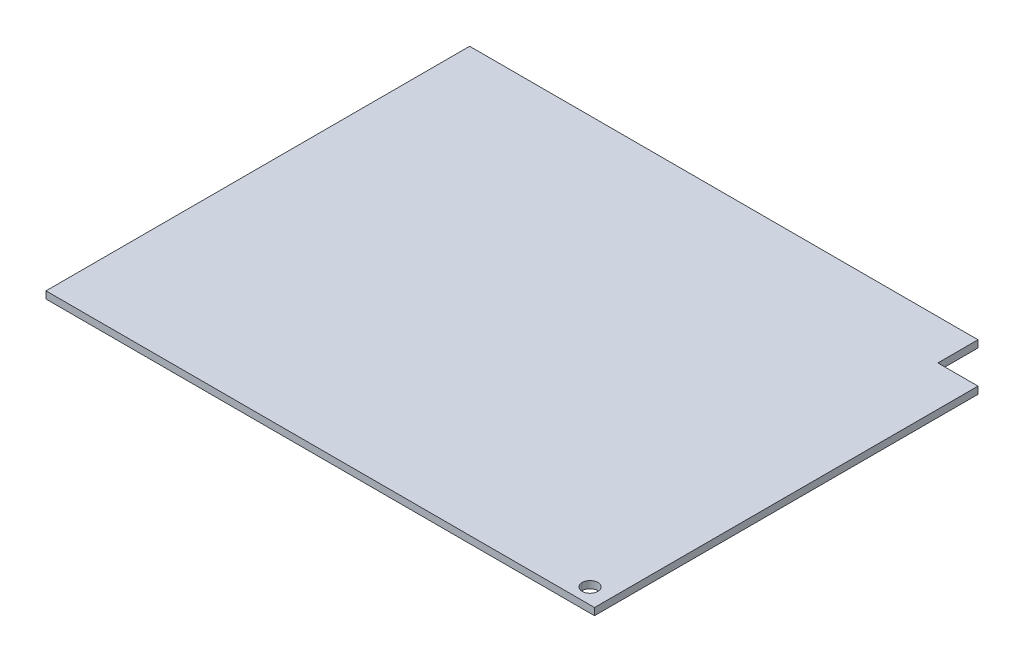
ISO-10303-21;
HEADER;
FILE_DESCRIPTION(('STEP AP214'),'2;1');
FILE_NAME('part.step','',(''),(''),'','','');
FILE_SCHEMA(('AUTOMOTIVE_DESIGN { 1 0 10303 214 1 1 1 1 }'));
ENDSEC;
DATA;
#1=APPLICATION_CONTEXT('core data for automotive mechanical design processes');
#2=APPLICATION_PROTOCOL_DEFINITION('international standard','automotive_design',2000,#1);
#3=PRODUCT_CONTEXT('',#1,'mechanical');
#4=PRODUCT('Part','Part','',(#3));
#5=PRODUCT_RELATED_PRODUCT_CATEGORY('part','',(#4));
#6=PRODUCT_DEFINITION_FORMATION('','',#4);
#7=PRODUCT_DEFINITION_CONTEXT('part definition',#1,'design');
#8=PRODUCT_DEFINITION('design','',#6,#7);
#9=PRODUCT_DEFINITION_SHAPE('','',#8);
#10=(LENGTH_UNIT() NAMED_UNIT(*) SI_UNIT(.MILLI.,.METRE.));
#11=(NAMED_UNIT(*) PLANE_ANGLE_UNIT() SI_UNIT($,.RADIAN.));
#12=(NAMED_UNIT(*) SI_UNIT($,.STERADIAN.) SOLID_ANGLE_UNIT());
#13=UNCERTAINTY_MEASURE_WITH_UNIT(LENGTH_MEASURE(1.E-05),#10,'distance_accuracy_value','');
#14=(GEOMETRIC_REPRESENTATION_CONTEXT(3) GLOBAL_UNCERTAINTY_ASSIGNED_CONTEXT((#13)) GLOBAL_UNIT_ASSIGNED_CONTEXT((#10,
#11,#12)) REPRESENTATION_CONTEXT('',''));
#15=CARTESIAN_POINT('',(0.,0.,0.));
#16=DIRECTION('',(0.,0.,1.));
#17=DIRECTION('',(1.,0.,0.));
#18=AXIS2_PLACEMENT_3D('',#15,#16,#17);
#19=CARTESIAN_POINT('',(57.,1.6,44.));
#20=DIRECTION('',(0.,1.,0.));
#21=DIRECTION('',(1.,0.,0.));
#22=AXIS2_PLACEMENT_3D('',#19,#20,#21);
#23=CYLINDRICAL_SURFACE('',#22,1.75);
#24=CARTESIAN_POINT('',(57.,1.6,44.));
#25=DIRECTION('',(0.,1.,0.));
#26=DIRECTION('',(1.,0.,0.));
#27=AXIS2_PLACEMENT_3D('',#24,#25,#26);
#28=CIRCLE('',#27,1.75);
#29=CARTESIAN_POINT('',(58.75,1.6,44.));
#30=VERTEX_POINT('',#29);
#31=CARTESIAN_POINT('',(55.25,1.6,44.));
#32=VERTEX_POINT('',#31);
#33=EDGE_CURVE('E261',#30,#32,#28,.T.);
#34=ORIENTED_EDGE('',*,*,#33,.T.);
#35=DIRECTION('',(0.,1.,0.));
#36=VECTOR('',#35,1.);
#37=CARTESIAN_POINT('',(55.25,1.6,44.));
#38=LINE('',#37,#36);
#39=CARTESIAN_POINT('',(55.25,0.,44.));
#40=VERTEX_POINT('',#39);
#41=EDGE_CURVE('E30',#40,#32,#38,.T.);
#42=ORIENTED_EDGE('',*,*,#41,.F.);
#43=CARTESIAN_POINT('',(57.,0.,44.));
#44=DIRECTION('',(0.,-1.,0.));
#45=DIRECTION('',(-1.,0.,0.));
#46=AXIS2_PLACEMENT_3D('',#43,#44,#45);
#47=CIRCLE('',#46,1.75);
#48=CARTESIAN_POINT('',(58.75,0.,44.));
#49=VERTEX_POINT('',#48);
#50=EDGE_CURVE('E197',#40,#49,#47,.T.);
#51=ORIENTED_EDGE('',*,*,#50,.T.);
#52=DIRECTION('',(0.,1.,0.));
#53=VECTOR('',#52,1.);
#54=CARTESIAN_POINT('',(58.75,1.6,44.));
#55=LINE('',#54,#53);
#56=EDGE_CURVE('E11',#49,#30,#55,.T.);
#57=ORIENTED_EDGE('',*,*,#56,.T.);
#58=EDGE_LOOP('',(#34,#42,#51,#57));
#59=FACE_BOUND('',#58,.T.);
#60=ADVANCED_FACE('F19',(#59),#23,.F.);
#61=CARTESIAN_POINT('',(57.,1.6,44.));
#62=DIRECTION('',(0.,1.,0.));
#63=DIRECTION('',(1.,0.,0.));
#64=AXIS2_PLACEMENT_3D('',#61,#62,#63);
#65=CYLINDRICAL_SURFACE('',#64,1.75);
#66=CARTESIAN_POINT('',(57.,0.,44.));
#67=DIRECTION('',(0.,-1.,0.));
#68=DIRECTION('',(-1.,0.,0.));
#69=AXIS2_PLACEMENT_3D('',#66,#67,#68);
#70=CIRCLE('',#69,1.75);
#71=EDGE_CURVE('E190',#49,#40,#70,.T.);
#72=ORIENTED_EDGE('',*,*,#71,.T.);
#73=ORIENTED_EDGE('',*,*,#41,.T.);
#74=CARTESIAN_POINT('',(57.,1.6,44.));
#75=DIRECTION('',(0.,1.,0.));
#76=DIRECTION('',(1.,0.,0.));
#77=AXIS2_PLACEMENT_3D('',#74,#75,#76);
#78=CIRCLE('',#77,1.75);
#79=EDGE_CURVE('E267',#32,#30,#78,.T.);
#80=ORIENTED_EDGE('',*,*,#79,.T.);
#81=ORIENTED_EDGE('',*,*,#56,.F.);
#82=EDGE_LOOP('',(#72,#73,#80,#81));
#83=FACE_BOUND('',#82,.T.);
#84=ADVANCED_FACE('F293',(#83),#65,.F.);
#85=CARTESIAN_POINT('',(0.,1.6,0.));
#86=DIRECTION('',(0.,1.,0.));
#87=DIRECTION('',(1.,0.,0.));
#88=AXIS2_PLACEMENT_3D('',#85,#86,#87);
#89=PLANE('',#88);
#90=ORIENTED_EDGE('',*,*,#33,.F.);
#91=ORIENTED_EDGE('',*,*,#79,.F.);
#92=EDGE_LOOP('',(#90,#91));
#93=FACE_BOUND('',#92,.T.);
#94=DIRECTION('',(0.,0.,-1.));
#95=VECTOR('',#94,1.);
#96=CARTESIAN_POINT('',(52.5,1.6,-38.5));
#97=LINE('',#96,#95);
#98=CARTESIAN_POINT('',(52.5,1.6,-38.5));
#99=VERTEX_POINT('',#98);
#100=CARTESIAN_POINT('',(52.5,1.6,-47.5));
#101=VERTEX_POINT('',#100);
#102=EDGE_CURVE('E133',#99,#101,#97,.T.);
#103=ORIENTED_EDGE('',*,*,#102,.T.);
#104=DIRECTION('',(1.,0.,0.));
#105=VECTOR('',#104,1.);
#106=CARTESIAN_POINT('',(-61.5,1.6,-47.5));
#107=LINE('',#106,#105);
#108=CARTESIAN_POINT('',(-61.5,1.6,-47.5));
#109=VERTEX_POINT('',#108);
#110=EDGE_CURVE('E96',#109,#101,#107,.T.);
#111=ORIENTED_EDGE('',*,*,#110,.F.);
#112=DIRECTION('',(0.,0.,-1.));
#113=VECTOR('',#112,1.);
#114=CARTESIAN_POINT('',(-61.5,1.6,47.5));
#115=LINE('',#114,#113);
#116=CARTESIAN_POINT('',(-61.5,1.6,47.5));
#117=VERTEX_POINT('',#116);
#118=EDGE_CURVE('E105',#117,#109,#115,.T.);
#119=ORIENTED_EDGE('',*,*,#118,.F.);
#120=DIRECTION('',(-1.,0.,0.));
#121=VECTOR('',#120,1.);
#122=CARTESIAN_POINT('',(61.5,1.6,47.5));
#123=LINE('',#122,#121);
#124=CARTESIAN_POINT('',(61.5,1.6,47.5));
#125=VERTEX_POINT('',#124);
#126=EDGE_CURVE('E236',#125,#117,#123,.T.);
#127=ORIENTED_EDGE('',*,*,#126,.F.);
#128=DIRECTION('',(0.,0.,1.));
#129=VECTOR('',#128,1.);
#130=CARTESIAN_POINT('',(61.5,1.6,-38.5));
#131=LINE('',#130,#129);
#132=CARTESIAN_POINT('',(61.5,1.6,-38.5));
#133=VERTEX_POINT('',#132);
#134=EDGE_CURVE('E227',#133,#125,#131,.T.);
#135=ORIENTED_EDGE('',*,*,#134,.F.);
#136=DIRECTION('',(1.,0.,0.));
#137=VECTOR('',#136,1.);
#138=CARTESIAN_POINT('',(52.5,1.6,-38.5));
#139=LINE('',#138,#137);
#140=EDGE_CURVE('E137',#99,#133,#139,.T.);
#141=ORIENTED_EDGE('',*,*,#140,.F.);
#142=EDGE_LOOP('',(#103,#111,#119,#127,#135,#141));
#143=FACE_BOUND('',#142,.T.);
#144=ADVANCED_FACE('F297',(#93,#143),#89,.T.);
#145=CARTESIAN_POINT('',(61.5,0.,-47.5));
#146=DIRECTION('',(0.,0.,-1.));
#147=DIRECTION('',(0.,-1.,0.));
#148=AXIS2_PLACEMENT_3D('',#145,#146,#147);
#149=PLANE('',#148);
#150=DIRECTION('',(0.,-1.,0.));
#151=VECTOR('',#150,1.);
#152=CARTESIAN_POINT('',(52.5,1.6,-47.5));
#153=LINE('',#152,#151);
#154=CARTESIAN_POINT('',(52.5,0.,-47.5));
#155=VERTEX_POINT('',#154);
#156=EDGE_CURVE('E120',#101,#155,#153,.T.);
#157=ORIENTED_EDGE('',*,*,#156,.T.);
#158=DIRECTION('',(1.,0.,0.));
#159=VECTOR('',#158,1.);
#160=CARTESIAN_POINT('',(-61.5,0.,-47.5));
#161=LINE('',#160,#159);
#162=CARTESIAN_POINT('',(-61.5,0.,-47.5));
#163=VERTEX_POINT('',#162);
#164=EDGE_CURVE('E150',#163,#155,#161,.T.);
#165=ORIENTED_EDGE('',*,*,#164,.F.);
#166=DIRECTION('',(0.,-1.,0.));
#167=VECTOR('',#166,1.);
#168=CARTESIAN_POINT('',(-61.5,1.6,-47.5));
#169=LINE('',#168,#167);
#170=EDGE_CURVE('E251',#109,#163,#169,.T.);
#171=ORIENTED_EDGE('',*,*,#170,.F.);
#172=ORIENTED_EDGE('',*,*,#110,.T.);
#173=EDGE_LOOP('',(#157,#165,#171,#172));
#174=FACE_BOUND('',#173,.T.);
#175=ADVANCED_FACE('F302',(#174),#149,.T.);
#176=CARTESIAN_POINT('',(-61.5,0.,-47.5));
#177=DIRECTION('',(-1.,0.,0.));
#178=DIRECTION('',(0.,0.,1.));
#179=AXIS2_PLACEMENT_3D('',#176,#177,#178);
#180=PLANE('',#179);
#181=DIRECTION('',(0.,0.,-1.));
#182=VECTOR('',#181,1.);
#183=CARTESIAN_POINT('',(-61.5,0.,47.5));
#184=LINE('',#183,#182);
#185=CARTESIAN_POINT('',(-61.5,0.,47.5));
#186=VERTEX_POINT('',#185);
#187=EDGE_CURVE('E176',#186,#163,#184,.T.);
#188=ORIENTED_EDGE('',*,*,#187,.F.);
#189=DIRECTION('',(0.,-1.,0.));
#190=VECTOR('',#189,1.);
#191=CARTESIAN_POINT('',(-61.5,1.6,47.5));
#192=LINE('',#191,#190);
#193=EDGE_CURVE('E84',#117,#186,#192,.T.);
#194=ORIENTED_EDGE('',*,*,#193,.F.);
#195=ORIENTED_EDGE('',*,*,#118,.T.);
#196=ORIENTED_EDGE('',*,*,#170,.T.);
#197=EDGE_LOOP('',(#188,#194,#195,#196));
#198=FACE_BOUND('',#197,.T.);
#199=ADVANCED_FACE('F306',(#198),#180,.T.);
#200=CARTESIAN_POINT('',(-61.5,0.,47.5));
#201=DIRECTION('',(0.,0.,1.));
#202=DIRECTION('',(1.,0.,0.));
#203=AXIS2_PLACEMENT_3D('',#200,#201,#202);
#204=PLANE('',#203);
#205=DIRECTION('',(-1.,0.,0.));
#206=VECTOR('',#205,1.);
#207=CARTESIAN_POINT('',(61.5,0.,47.5));
#208=LINE('',#207,#206);
#209=CARTESIAN_POINT('',(61.5,0.,47.5));
#210=VERTEX_POINT('',#209);
#211=EDGE_CURVE('E167',#210,#186,#208,.T.);
#212=ORIENTED_EDGE('',*,*,#211,.F.);
#213=DIRECTION('',(0.,-1.,0.));
#214=VECTOR('',#213,1.);
#215=CARTESIAN_POINT('',(61.5,1.6,47.5));
#216=LINE('',#215,#214);
#217=EDGE_CURVE('E73',#125,#210,#216,.T.);
#218=ORIENTED_EDGE('',*,*,#217,.F.);
#219=ORIENTED_EDGE('',*,*,#126,.T.);
#220=ORIENTED_EDGE('',*,*,#193,.T.);
#221=EDGE_LOOP('',(#212,#218,#219,#220));
#222=FACE_BOUND('',#221,.T.);
#223=ADVANCED_FACE('F289',(#222),#204,.T.);
#224=CARTESIAN_POINT('',(61.5,0.,47.5));
#225=DIRECTION('',(1.,0.,0.));
#226=DIRECTION('',(0.,1.,0.));
#227=AXIS2_PLACEMENT_3D('',#224,#225,#226);
#228=PLANE('',#227);
#229=DIRECTION('',(0.,-1.,0.));
#230=VECTOR('',#229,1.);
#231=CARTESIAN_POINT('',(61.5,1.6,-38.5));
#232=LINE('',#231,#230);
#233=CARTESIAN_POINT('',(61.5,0.,-38.5));
#234=VERTEX_POINT('',#233);
#235=EDGE_CURVE('E142',#133,#234,#232,.T.);
#236=ORIENTED_EDGE('',*,*,#235,.F.);
#237=ORIENTED_EDGE('',*,*,#134,.T.);
#238=ORIENTED_EDGE('',*,*,#217,.T.);
#239=DIRECTION('',(0.,0.,1.));
#240=VECTOR('',#239,1.);
#241=CARTESIAN_POINT('',(61.5,0.,-38.5));
#242=LINE('',#241,#240);
#243=EDGE_CURVE('E146',#234,#210,#242,.T.);
#244=ORIENTED_EDGE('',*,*,#243,.F.);
#245=EDGE_LOOP('',(#236,#237,#238,#244));
#246=FACE_BOUND('',#245,.T.);
#247=ADVANCED_FACE('F282',(#246),#228,.T.);
#248=CARTESIAN_POINT('',(52.5,1.6,-38.5));
#249=DIRECTION('',(0.,0.,1.));
#250=DIRECTION('',(1.,0.,0.));
#251=AXIS2_PLACEMENT_3D('',#248,#249,#250);
#252=PLANE('',#251);
#253=DIRECTION('',(1.,0.,0.));
#254=VECTOR('',#253,1.);
#255=CARTESIAN_POINT('',(52.5,0.,-38.5));
#256=LINE('',#255,#254);
#257=CARTESIAN_POINT('',(52.5,0.,-38.5));
#258=VERTEX_POINT('',#257);
#259=EDGE_CURVE('E140',#258,#234,#256,.T.);
#260=ORIENTED_EDGE('',*,*,#259,.F.);
#261=DIRECTION('',(0.,1.,0.));
#262=VECTOR('',#261,1.);
#263=CARTESIAN_POINT('',(52.5,0.,-38.5));
#264=LINE('',#263,#262);
#265=EDGE_CURVE('E129',#258,#99,#264,.T.);
#266=ORIENTED_EDGE('',*,*,#265,.T.);
#267=ORIENTED_EDGE('',*,*,#140,.T.);
#268=ORIENTED_EDGE('',*,*,#235,.T.);
#269=EDGE_LOOP('',(#260,#266,#267,#268));
#270=FACE_BOUND('',#269,.T.);
#271=ADVANCED_FACE('F21',(#270),#252,.F.);
#272=CARTESIAN_POINT('',(52.5,1.6,-48.8230237191));
#273=DIRECTION('',(-1.,0.,0.));
#274=DIRECTION('',(0.,0.,1.));
#275=AXIS2_PLACEMENT_3D('',#272,#273,#274);
#276=PLANE('',#275);
#277=DIRECTION('',(0.,0.,-1.));
#278=VECTOR('',#277,1.);
#279=CARTESIAN_POINT('',(52.5,0.,-38.5));
#280=LINE('',#279,#278);
#281=EDGE_CURVE('E23',#258,#155,#280,.T.);
#282=ORIENTED_EDGE('',*,*,#281,.T.);
#283=ORIENTED_EDGE('',*,*,#156,.F.);
#284=ORIENTED_EDGE('',*,*,#102,.F.);
#285=ORIENTED_EDGE('',*,*,#265,.F.);
#286=EDGE_LOOP('',(#282,#283,#284,#285));
#287=FACE_BOUND('',#286,.T.);
#288=ADVANCED_FACE('F131',(#287),#276,.F.);
#289=CARTESIAN_POINT('',(0.,0.,0.));
#290=DIRECTION('',(0.,1.,0.));
#291=DIRECTION('',(1.,0.,0.));
#292=AXIS2_PLACEMENT_3D('',#289,#290,#291);
#293=PLANE('',#292);
#294=ORIENTED_EDGE('',*,*,#71,.F.);
#295=ORIENTED_EDGE('',*,*,#50,.F.);
#296=EDGE_LOOP('',(#294,#295));
#297=FACE_BOUND('',#296,.T.);
#298=ORIENTED_EDGE('',*,*,#281,.F.);
#299=ORIENTED_EDGE('',*,*,#259,.T.);
#300=ORIENTED_EDGE('',*,*,#243,.T.);
#301=ORIENTED_EDGE('',*,*,#211,.T.);
#302=ORIENTED_EDGE('',*,*,#187,.T.);
#303=ORIENTED_EDGE('',*,*,#164,.T.);
#304=EDGE_LOOP('',(#298,#299,#300,#301,#302,#303));
#305=FACE_BOUND('',#304,.T.);
#306=ADVANCED_FACE('F148',(#297,#305),#293,.F.);
#307=CLOSED_SHELL('',(#60,#84,#144,#175,#199,#223,#247,#271,#288,#306));
#308=MANIFOLD_SOLID_BREP('B1',#307);
#309=ADVANCED_BREP_SHAPE_REPRESENTATION('',(#18,#308),#14);
#310=SHAPE_DEFINITION_REPRESENTATION(#9,#309);
ENDSEC;
END-ISO-10303-21;
